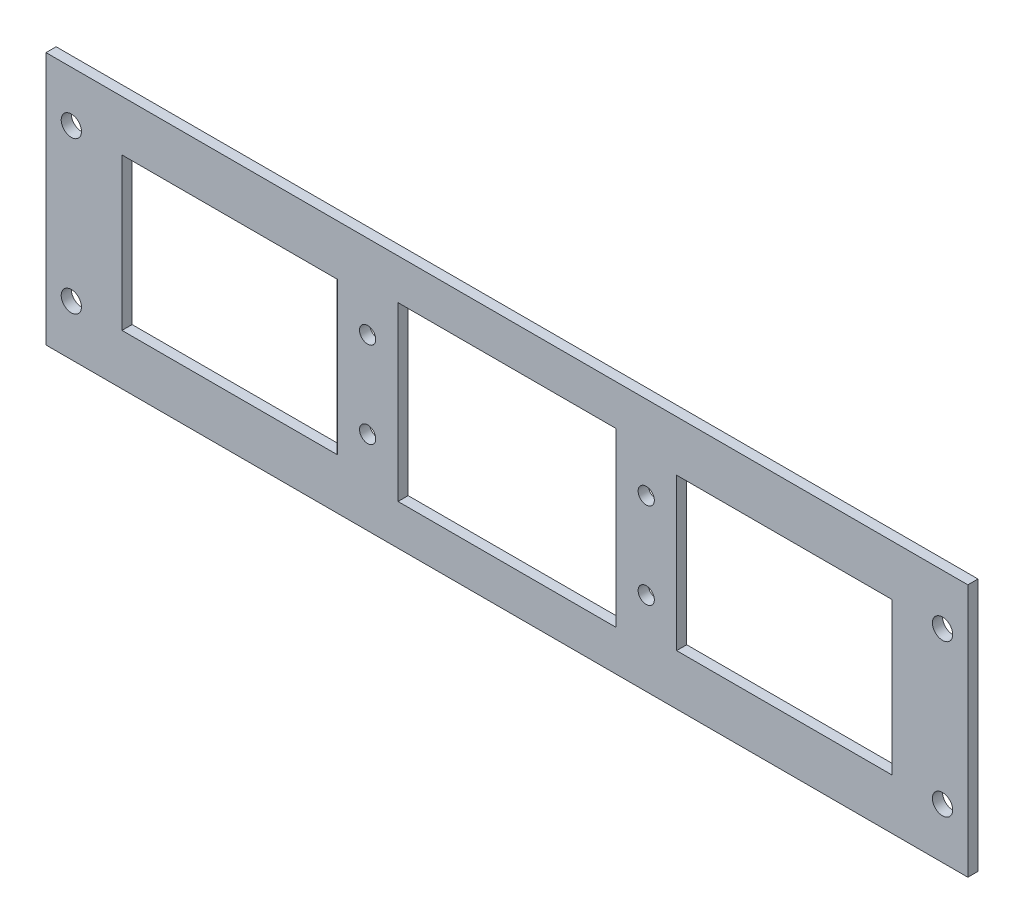
ISO-10303-21;
HEADER;
FILE_DESCRIPTION(('STEP AP214'),'2;1');
FILE_NAME('part.step','',(''),(''),'','','');
FILE_SCHEMA(('AUTOMOTIVE_DESIGN { 1 0 10303 214 1 1 1 1 }'));
ENDSEC;
DATA;
#1=APPLICATION_CONTEXT('core data for automotive mechanical design processes');
#2=APPLICATION_PROTOCOL_DEFINITION('international standard','automotive_design',2000,#1);
#3=PRODUCT_CONTEXT('',#1,'mechanical');
#4=PRODUCT('Part','Part','',(#3));
#5=PRODUCT_RELATED_PRODUCT_CATEGORY('part','',(#4));
#6=PRODUCT_DEFINITION_FORMATION('','',#4);
#7=PRODUCT_DEFINITION_CONTEXT('part definition',#1,'design');
#8=PRODUCT_DEFINITION('design','',#6,#7);
#9=PRODUCT_DEFINITION_SHAPE('','',#8);
#10=(LENGTH_UNIT() NAMED_UNIT(*) SI_UNIT(.MILLI.,.METRE.));
#11=(NAMED_UNIT(*) PLANE_ANGLE_UNIT() SI_UNIT($,.RADIAN.));
#12=(NAMED_UNIT(*) SI_UNIT($,.STERADIAN.) SOLID_ANGLE_UNIT());
#13=UNCERTAINTY_MEASURE_WITH_UNIT(LENGTH_MEASURE(1.E-05),#10,'distance_accuracy_value','');
#14=(GEOMETRIC_REPRESENTATION_CONTEXT(3) GLOBAL_UNCERTAINTY_ASSIGNED_CONTEXT((#13)) GLOBAL_UNIT_ASSIGNED_CONTEXT((#10,
#11,#12)) REPRESENTATION_CONTEXT('',''));
#15=CARTESIAN_POINT('',(0.,0.,0.));
#16=DIRECTION('',(0.,0.,1.));
#17=DIRECTION('',(1.,0.,0.));
#18=AXIS2_PLACEMENT_3D('',#15,#16,#17);
#19=CARTESIAN_POINT('',(0.,0.,2.));
#20=DIRECTION('',(0.,0.,-1.));
#21=DIRECTION('',(-1.,0.,0.));
#22=AXIS2_PLACEMENT_3D('',#19,#20,#21);
#23=PLANE('',#22);
#24=DIRECTION('',(-1.,0.,0.));
#25=VECTOR('',#24,1.);
#26=CARTESIAN_POINT('',(33.5,15.,2.));
#27=LINE('',#26,#25);
#28=CARTESIAN_POINT('',(76.,15.,2.));
#29=VERTEX_POINT('',#28);
#30=CARTESIAN_POINT('',(33.5,15.,2.));
#31=VERTEX_POINT('',#30);
#32=EDGE_CURVE('E203',#29,#31,#27,.T.);
#33=ORIENTED_EDGE('',*,*,#32,.F.);
#34=DIRECTION('',(0.,1.,0.));
#35=VECTOR('',#34,1.);
#36=CARTESIAN_POINT('',(76.,15.,2.));
#37=LINE('',#36,#35);
#38=CARTESIAN_POINT('',(76.,-15.,2.));
#39=VERTEX_POINT('',#38);
#40=EDGE_CURVE('E49',#39,#29,#37,.T.);
#41=ORIENTED_EDGE('',*,*,#40,.F.);
#42=DIRECTION('',(1.,0.,0.));
#43=VECTOR('',#42,1.);
#44=CARTESIAN_POINT('',(33.5,-15.,2.));
#45=LINE('',#44,#43);
#46=CARTESIAN_POINT('',(33.5,-15.,2.));
#47=VERTEX_POINT('',#46);
#48=EDGE_CURVE('E192',#47,#39,#45,.T.);
#49=ORIENTED_EDGE('',*,*,#48,.F.);
#50=DIRECTION('',(0.,-1.,0.));
#51=VECTOR('',#50,1.);
#52=CARTESIAN_POINT('',(33.5,15.,2.));
#53=LINE('',#52,#51);
#54=EDGE_CURVE('E206',#31,#47,#53,.T.);
#55=ORIENTED_EDGE('',*,*,#54,.F.);
#56=EDGE_LOOP('',(#33,#41,#49,#55));
#57=FACE_BOUND('',#56,.T.);
#58=DIRECTION('',(-1.,0.,0.));
#59=VECTOR('',#58,1.);
#60=CARTESIAN_POINT('',(-76.,15.,2.));
#61=LINE('',#60,#59);
#62=CARTESIAN_POINT('',(-33.5,15.,2.));
#63=VERTEX_POINT('',#62);
#64=CARTESIAN_POINT('',(-76.,15.,2.));
#65=VERTEX_POINT('',#64);
#66=EDGE_CURVE('E177',#63,#65,#61,.T.);
#67=ORIENTED_EDGE('',*,*,#66,.F.);
#68=DIRECTION('',(0.,1.,0.));
#69=VECTOR('',#68,1.);
#70=CARTESIAN_POINT('',(-33.5,15.,2.));
#71=LINE('',#70,#69);
#72=CARTESIAN_POINT('',(-33.5,-15.,2.));
#73=VERTEX_POINT('',#72);
#74=EDGE_CURVE('E57',#73,#63,#71,.T.);
#75=ORIENTED_EDGE('',*,*,#74,.F.);
#76=DIRECTION('',(1.,0.,0.));
#77=VECTOR('',#76,1.);
#78=CARTESIAN_POINT('',(-76.,-15.,2.));
#79=LINE('',#78,#77);
#80=CARTESIAN_POINT('',(-76.,-15.,2.));
#81=VERTEX_POINT('',#80);
#82=EDGE_CURVE('E168',#81,#73,#79,.T.);
#83=ORIENTED_EDGE('',*,*,#82,.F.);
#84=DIRECTION('',(0.,-1.,0.));
#85=VECTOR('',#84,1.);
#86=CARTESIAN_POINT('',(-76.,15.,2.));
#87=LINE('',#86,#85);
#88=EDGE_CURVE('E171',#65,#81,#87,.T.);
#89=ORIENTED_EDGE('',*,*,#88,.F.);
#90=EDGE_LOOP('',(#67,#75,#83,#89));
#91=FACE_BOUND('',#90,.T.);
#92=DIRECTION('',(-1.,0.,0.));
#93=VECTOR('',#92,1.);
#94=CARTESIAN_POINT('',(-21.5,17.,2.));
#95=LINE('',#94,#93);
#96=CARTESIAN_POINT('',(21.5,17.,2.));
#97=VERTEX_POINT('',#96);
#98=CARTESIAN_POINT('',(-21.5,17.,2.));
#99=VERTEX_POINT('',#98);
#100=EDGE_CURVE('E232',#97,#99,#95,.T.);
#101=ORIENTED_EDGE('',*,*,#100,.F.);
#102=DIRECTION('',(0.,1.,0.));
#103=VECTOR('',#102,1.);
#104=CARTESIAN_POINT('',(21.5,17.,2.));
#105=LINE('',#104,#103);
#106=CARTESIAN_POINT('',(21.5,-17.,2.));
#107=VERTEX_POINT('',#106);
#108=EDGE_CURVE('E184',#107,#97,#105,.T.);
#109=ORIENTED_EDGE('',*,*,#108,.F.);
#110=DIRECTION('',(1.,0.,0.));
#111=VECTOR('',#110,1.);
#112=CARTESIAN_POINT('',(-21.5,-17.,2.));
#113=LINE('',#112,#111);
#114=CARTESIAN_POINT('',(-21.5,-17.,2.));
#115=VERTEX_POINT('',#114);
#116=EDGE_CURVE('E221',#115,#107,#113,.T.);
#117=ORIENTED_EDGE('',*,*,#116,.F.);
#118=DIRECTION('',(0.,-1.,0.));
#119=VECTOR('',#118,1.);
#120=CARTESIAN_POINT('',(-21.5,17.,2.));
#121=LINE('',#120,#119);
#122=EDGE_CURVE('E235',#99,#115,#121,.T.);
#123=ORIENTED_EDGE('',*,*,#122,.F.);
#124=EDGE_LOOP('',(#101,#109,#117,#123));
#125=FACE_BOUND('',#124,.T.);
#126=CARTESIAN_POINT('',(-27.5,-8.5,2.));
#127=DIRECTION('',(0.,0.,1.));
#128=DIRECTION('',(1.,0.,0.));
#129=AXIS2_PLACEMENT_3D('',#126,#127,#128);
#130=CIRCLE('',#129,1.6);
#131=CARTESIAN_POINT('',(-25.9,-8.5,2.));
#132=VERTEX_POINT('',#131);
#133=EDGE_CURVE('E259',#132,#132,#130,.T.);
#134=ORIENTED_EDGE('',*,*,#133,.F.);
#135=EDGE_LOOP('',(#134));
#136=FACE_BOUND('',#135,.T.);
#137=CARTESIAN_POINT('',(27.5,8.5,2.));
#138=DIRECTION('',(0.,0.,1.));
#139=DIRECTION('',(1.,0.,0.));
#140=AXIS2_PLACEMENT_3D('',#137,#138,#139);
#141=CIRCLE('',#140,1.6);
#142=CARTESIAN_POINT('',(29.1,8.5,2.));
#143=VERTEX_POINT('',#142);
#144=EDGE_CURVE('E252',#143,#143,#141,.T.);
#145=ORIENTED_EDGE('',*,*,#144,.F.);
#146=EDGE_LOOP('',(#145));
#147=FACE_BOUND('',#146,.T.);
#148=CARTESIAN_POINT('',(27.5,-8.5,2.));
#149=DIRECTION('',(0.,0.,1.));
#150=DIRECTION('',(1.,0.,0.));
#151=AXIS2_PLACEMENT_3D('',#148,#149,#150);
#152=CIRCLE('',#151,1.6);
#153=CARTESIAN_POINT('',(29.1,-8.5,2.));
#154=VERTEX_POINT('',#153);
#155=EDGE_CURVE('E242',#154,#154,#152,.T.);
#156=ORIENTED_EDGE('',*,*,#155,.F.);
#157=EDGE_LOOP('',(#156));
#158=FACE_BOUND('',#157,.T.);
#159=CARTESIAN_POINT('',(-27.5,8.5,2.));
#160=DIRECTION('',(0.,0.,1.));
#161=DIRECTION('',(1.,0.,0.));
#162=AXIS2_PLACEMENT_3D('',#159,#160,#161);
#163=CIRCLE('',#162,1.6);
#164=CARTESIAN_POINT('',(-25.9,8.5,2.));
#165=VERTEX_POINT('',#164);
#166=EDGE_CURVE('E258',#165,#165,#163,.T.);
#167=ORIENTED_EDGE('',*,*,#166,.F.);
#168=EDGE_LOOP('',(#167));
#169=FACE_BOUND('',#168,.T.);
#170=DIRECTION('',(0.,1.,0.));
#171=VECTOR('',#170,1.);
#172=CARTESIAN_POINT('',(91.,-25.,2.));
#173=LINE('',#172,#171);
#174=CARTESIAN_POINT('',(91.,-25.,2.));
#175=VERTEX_POINT('',#174);
#176=CARTESIAN_POINT('',(91.,25.,2.));
#177=VERTEX_POINT('',#176);
#178=EDGE_CURVE('E297',#175,#177,#173,.T.);
#179=ORIENTED_EDGE('',*,*,#178,.T.);
#180=DIRECTION('',(-1.,0.,0.));
#181=VECTOR('',#180,1.);
#182=CARTESIAN_POINT('',(-91.,25.,2.));
#183=LINE('',#182,#181);
#184=CARTESIAN_POINT('',(-91.,25.,2.));
#185=VERTEX_POINT('',#184);
#186=EDGE_CURVE('E300',#177,#185,#183,.T.);
#187=ORIENTED_EDGE('',*,*,#186,.T.);
#188=DIRECTION('',(0.,-1.,0.));
#189=VECTOR('',#188,1.);
#190=CARTESIAN_POINT('',(-91.,-25.,2.));
#191=LINE('',#190,#189);
#192=CARTESIAN_POINT('',(-91.,-25.,2.));
#193=VERTEX_POINT('',#192);
#194=EDGE_CURVE('E303',#185,#193,#191,.T.);
#195=ORIENTED_EDGE('',*,*,#194,.T.);
#196=DIRECTION('',(1.,0.,0.));
#197=VECTOR('',#196,1.);
#198=CARTESIAN_POINT('',(-91.,-25.,2.));
#199=LINE('',#198,#197);
#200=EDGE_CURVE('E305',#193,#175,#199,.T.);
#201=ORIENTED_EDGE('',*,*,#200,.T.);
#202=EDGE_LOOP('',(#179,#187,#195,#201));
#203=FACE_BOUND('',#202,.T.);
#204=CARTESIAN_POINT('',(-86.,15.,2.));
#205=DIRECTION('',(0.,0.,1.));
#206=DIRECTION('',(1.,0.,0.));
#207=AXIS2_PLACEMENT_3D('',#204,#205,#206);
#208=CIRCLE('',#207,2.);
#209=CARTESIAN_POINT('',(-84.,15.,2.));
#210=VERTEX_POINT('',#209);
#211=EDGE_CURVE('E291',#210,#210,#208,.T.);
#212=ORIENTED_EDGE('',*,*,#211,.F.);
#213=EDGE_LOOP('',(#212));
#214=FACE_BOUND('',#213,.T.);
#215=CARTESIAN_POINT('',(86.,15.,2.));
#216=DIRECTION('',(0.,0.,1.));
#217=DIRECTION('',(1.,0.,0.));
#218=AXIS2_PLACEMENT_3D('',#215,#216,#217);
#219=CIRCLE('',#218,2.);
#220=CARTESIAN_POINT('',(88.,15.,2.));
#221=VERTEX_POINT('',#220);
#222=EDGE_CURVE('E285',#221,#221,#219,.T.);
#223=ORIENTED_EDGE('',*,*,#222,.F.);
#224=EDGE_LOOP('',(#223));
#225=FACE_BOUND('',#224,.T.);
#226=CARTESIAN_POINT('',(-86.,-15.,2.));
#227=DIRECTION('',(0.,0.,1.));
#228=DIRECTION('',(1.,0.,0.));
#229=AXIS2_PLACEMENT_3D('',#226,#227,#228);
#230=CIRCLE('',#229,2.);
#231=CARTESIAN_POINT('',(-84.,-15.,2.));
#232=VERTEX_POINT('',#231);
#233=EDGE_CURVE('E279',#232,#232,#230,.T.);
#234=ORIENTED_EDGE('',*,*,#233,.F.);
#235=EDGE_LOOP('',(#234));
#236=FACE_BOUND('',#235,.T.);
#237=CARTESIAN_POINT('',(86.,-15.,2.));
#238=DIRECTION('',(0.,0.,1.));
#239=DIRECTION('',(1.,0.,0.));
#240=AXIS2_PLACEMENT_3D('',#237,#238,#239);
#241=CIRCLE('',#240,2.);
#242=CARTESIAN_POINT('',(88.,-15.,2.));
#243=VERTEX_POINT('',#242);
#244=EDGE_CURVE('E273',#243,#243,#241,.T.);
#245=ORIENTED_EDGE('',*,*,#244,.F.);
#246=EDGE_LOOP('',(#245));
#247=FACE_BOUND('',#246,.T.);
#248=ADVANCED_FACE('F34',(#57,#91,#125,#136,#147,#158,#169,#203,#214,#225,#236,#247),#23,.F.);
#249=CARTESIAN_POINT('',(0.,0.,0.));
#250=DIRECTION('',(0.,0.,-1.));
#251=DIRECTION('',(-1.,0.,0.));
#252=AXIS2_PLACEMENT_3D('',#249,#250,#251);
#253=PLANE('',#252);
#254=DIRECTION('',(0.,1.,0.));
#255=VECTOR('',#254,1.);
#256=CARTESIAN_POINT('',(76.,15.,0.));
#257=LINE('',#256,#255);
#258=CARTESIAN_POINT('',(76.,-15.,0.));
#259=VERTEX_POINT('',#258);
#260=CARTESIAN_POINT('',(76.,15.,0.));
#261=VERTEX_POINT('',#260);
#262=EDGE_CURVE('E188',#259,#261,#257,.T.);
#263=ORIENTED_EDGE('',*,*,#262,.T.);
#264=DIRECTION('',(-1.,0.,0.));
#265=VECTOR('',#264,1.);
#266=CARTESIAN_POINT('',(33.5,15.,0.));
#267=LINE('',#266,#265);
#268=CARTESIAN_POINT('',(33.5,15.,0.));
#269=VERTEX_POINT('',#268);
#270=EDGE_CURVE('E191',#261,#269,#267,.T.);
#271=ORIENTED_EDGE('',*,*,#270,.T.);
#272=DIRECTION('',(0.,-1.,0.));
#273=VECTOR('',#272,1.);
#274=CARTESIAN_POINT('',(33.5,15.,0.));
#275=LINE('',#274,#273);
#276=CARTESIAN_POINT('',(33.5,-15.,0.));
#277=VERTEX_POINT('',#276);
#278=EDGE_CURVE('E195',#269,#277,#275,.T.);
#279=ORIENTED_EDGE('',*,*,#278,.T.);
#280=DIRECTION('',(1.,0.,0.));
#281=VECTOR('',#280,1.);
#282=CARTESIAN_POINT('',(33.5,-15.,0.));
#283=LINE('',#282,#281);
#284=EDGE_CURVE('E198',#277,#259,#283,.T.);
#285=ORIENTED_EDGE('',*,*,#284,.T.);
#286=EDGE_LOOP('',(#263,#271,#279,#285));
#287=FACE_BOUND('',#286,.T.);
#288=DIRECTION('',(0.,1.,0.));
#289=VECTOR('',#288,1.);
#290=CARTESIAN_POINT('',(-33.5,15.,0.));
#291=LINE('',#290,#289);
#292=CARTESIAN_POINT('',(-33.5,-15.,0.));
#293=VERTEX_POINT('',#292);
#294=CARTESIAN_POINT('',(-33.5,15.,0.));
#295=VERTEX_POINT('',#294);
#296=EDGE_CURVE('E149',#293,#295,#291,.T.);
#297=ORIENTED_EDGE('',*,*,#296,.T.);
#298=DIRECTION('',(-1.,0.,0.));
#299=VECTOR('',#298,1.);
#300=CARTESIAN_POINT('',(-76.,15.,0.));
#301=LINE('',#300,#299);
#302=CARTESIAN_POINT('',(-76.,15.,0.));
#303=VERTEX_POINT('',#302);
#304=EDGE_CURVE('E159',#295,#303,#301,.T.);
#305=ORIENTED_EDGE('',*,*,#304,.T.);
#306=DIRECTION('',(0.,-1.,0.));
#307=VECTOR('',#306,1.);
#308=CARTESIAN_POINT('',(-76.,15.,0.));
#309=LINE('',#308,#307);
#310=CARTESIAN_POINT('',(-76.,-15.,0.));
#311=VERTEX_POINT('',#310);
#312=EDGE_CURVE('E163',#303,#311,#309,.T.);
#313=ORIENTED_EDGE('',*,*,#312,.T.);
#314=DIRECTION('',(1.,0.,0.));
#315=VECTOR('',#314,1.);
#316=CARTESIAN_POINT('',(-76.,-15.,0.));
#317=LINE('',#316,#315);
#318=EDGE_CURVE('E155',#311,#293,#317,.T.);
#319=ORIENTED_EDGE('',*,*,#318,.T.);
#320=EDGE_LOOP('',(#297,#305,#313,#319));
#321=FACE_BOUND('',#320,.T.);
#322=DIRECTION('',(0.,1.,0.));
#323=VECTOR('',#322,1.);
#324=CARTESIAN_POINT('',(21.5,17.,0.));
#325=LINE('',#324,#323);
#326=CARTESIAN_POINT('',(21.5,-17.,0.));
#327=VERTEX_POINT('',#326);
#328=CARTESIAN_POINT('',(21.5,17.,0.));
#329=VERTEX_POINT('',#328);
#330=EDGE_CURVE('E217',#327,#329,#325,.T.);
#331=ORIENTED_EDGE('',*,*,#330,.T.);
#332=DIRECTION('',(-1.,0.,0.));
#333=VECTOR('',#332,1.);
#334=CARTESIAN_POINT('',(-21.5,17.,0.));
#335=LINE('',#334,#333);
#336=CARTESIAN_POINT('',(-21.5,17.,0.));
#337=VERTEX_POINT('',#336);
#338=EDGE_CURVE('E220',#329,#337,#335,.T.);
#339=ORIENTED_EDGE('',*,*,#338,.T.);
#340=DIRECTION('',(0.,-1.,0.));
#341=VECTOR('',#340,1.);
#342=CARTESIAN_POINT('',(-21.5,17.,0.));
#343=LINE('',#342,#341);
#344=CARTESIAN_POINT('',(-21.5,-17.,0.));
#345=VERTEX_POINT('',#344);
#346=EDGE_CURVE('E224',#337,#345,#343,.T.);
#347=ORIENTED_EDGE('',*,*,#346,.T.);
#348=DIRECTION('',(1.,0.,0.));
#349=VECTOR('',#348,1.);
#350=CARTESIAN_POINT('',(-21.5,-17.,0.));
#351=LINE('',#350,#349);
#352=EDGE_CURVE('E227',#345,#327,#351,.T.);
#353=ORIENTED_EDGE('',*,*,#352,.T.);
#354=EDGE_LOOP('',(#331,#339,#347,#353));
#355=FACE_BOUND('',#354,.T.);
#356=CARTESIAN_POINT('',(-27.5,-8.5,0.));
#357=DIRECTION('',(0.,0.,1.));
#358=DIRECTION('',(1.,0.,0.));
#359=AXIS2_PLACEMENT_3D('',#356,#357,#358);
#360=CIRCLE('',#359,1.6);
#361=CARTESIAN_POINT('',(-25.9,-8.5,0.));
#362=VERTEX_POINT('',#361);
#363=EDGE_CURVE('E255',#362,#362,#360,.T.);
#364=ORIENTED_EDGE('',*,*,#363,.T.);
#365=EDGE_LOOP('',(#364));
#366=FACE_BOUND('',#365,.T.);
#367=CARTESIAN_POINT('',(27.5,8.5,0.));
#368=DIRECTION('',(0.,0.,1.));
#369=DIRECTION('',(1.,0.,0.));
#370=AXIS2_PLACEMENT_3D('',#367,#368,#369);
#371=CIRCLE('',#370,1.6);
#372=CARTESIAN_POINT('',(29.1,8.5,0.));
#373=VERTEX_POINT('',#372);
#374=EDGE_CURVE('E262',#373,#373,#371,.T.);
#375=ORIENTED_EDGE('',*,*,#374,.T.);
#376=EDGE_LOOP('',(#375));
#377=FACE_BOUND('',#376,.T.);
#378=CARTESIAN_POINT('',(27.5,-8.5,0.));
#379=DIRECTION('',(0.,0.,1.));
#380=DIRECTION('',(1.,0.,0.));
#381=AXIS2_PLACEMENT_3D('',#378,#379,#380);
#382=CIRCLE('',#381,1.6);
#383=CARTESIAN_POINT('',(29.1,-8.5,0.));
#384=VERTEX_POINT('',#383);
#385=EDGE_CURVE('E249',#384,#384,#382,.T.);
#386=ORIENTED_EDGE('',*,*,#385,.T.);
#387=EDGE_LOOP('',(#386));
#388=FACE_BOUND('',#387,.T.);
#389=CARTESIAN_POINT('',(-27.5,8.5,0.));
#390=DIRECTION('',(0.,0.,1.));
#391=DIRECTION('',(1.,0.,0.));
#392=AXIS2_PLACEMENT_3D('',#389,#390,#391);
#393=CIRCLE('',#392,1.6);
#394=CARTESIAN_POINT('',(-25.9,8.5,0.));
#395=VERTEX_POINT('',#394);
#396=EDGE_CURVE('E267',#395,#395,#393,.T.);
#397=ORIENTED_EDGE('',*,*,#396,.T.);
#398=EDGE_LOOP('',(#397));
#399=FACE_BOUND('',#398,.T.);
#400=CARTESIAN_POINT('',(-86.,-15.,0.));
#401=DIRECTION('',(0.,0.,1.));
#402=DIRECTION('',(1.,0.,0.));
#403=AXIS2_PLACEMENT_3D('',#400,#401,#402);
#404=CIRCLE('',#403,2.);
#405=CARTESIAN_POINT('',(-84.,-15.,0.));
#406=VERTEX_POINT('',#405);
#407=EDGE_CURVE('E276',#406,#406,#404,.T.);
#408=ORIENTED_EDGE('',*,*,#407,.T.);
#409=EDGE_LOOP('',(#408));
#410=FACE_BOUND('',#409,.T.);
#411=CARTESIAN_POINT('',(-86.,15.,0.));
#412=DIRECTION('',(0.,0.,1.));
#413=DIRECTION('',(1.,0.,0.));
#414=AXIS2_PLACEMENT_3D('',#411,#412,#413);
#415=CIRCLE('',#414,2.);
#416=CARTESIAN_POINT('',(-84.,15.,0.));
#417=VERTEX_POINT('',#416);
#418=EDGE_CURVE('E288',#417,#417,#415,.T.);
#419=ORIENTED_EDGE('',*,*,#418,.T.);
#420=EDGE_LOOP('',(#419));
#421=FACE_BOUND('',#420,.T.);
#422=DIRECTION('',(0.,1.,0.));
#423=VECTOR('',#422,1.);
#424=CARTESIAN_POINT('',(91.,-25.,0.));
#425=LINE('',#424,#423);
#426=CARTESIAN_POINT('',(91.,-25.,0.));
#427=VERTEX_POINT('',#426);
#428=CARTESIAN_POINT('',(91.,25.,0.));
#429=VERTEX_POINT('',#428);
#430=EDGE_CURVE('E294',#427,#429,#425,.T.);
#431=ORIENTED_EDGE('',*,*,#430,.F.);
#432=DIRECTION('',(1.,0.,0.));
#433=VECTOR('',#432,1.);
#434=CARTESIAN_POINT('',(-91.,-25.,0.));
#435=LINE('',#434,#433);
#436=CARTESIAN_POINT('',(-91.,-25.,0.));
#437=VERTEX_POINT('',#436);
#438=EDGE_CURVE('E301',#437,#427,#435,.T.);
#439=ORIENTED_EDGE('',*,*,#438,.F.);
#440=DIRECTION('',(0.,-1.,0.));
#441=VECTOR('',#440,1.);
#442=CARTESIAN_POINT('',(-91.,-25.,0.));
#443=LINE('',#442,#441);
#444=CARTESIAN_POINT('',(-91.,25.,0.));
#445=VERTEX_POINT('',#444);
#446=EDGE_CURVE('E312',#445,#437,#443,.T.);
#447=ORIENTED_EDGE('',*,*,#446,.F.);
#448=DIRECTION('',(-1.,0.,0.));
#449=VECTOR('',#448,1.);
#450=CARTESIAN_POINT('',(-91.,25.,0.));
#451=LINE('',#450,#449);
#452=EDGE_CURVE('E310',#429,#445,#451,.T.);
#453=ORIENTED_EDGE('',*,*,#452,.F.);
#454=EDGE_LOOP('',(#431,#439,#447,#453));
#455=FACE_BOUND('',#454,.T.);
#456=CARTESIAN_POINT('',(86.,15.,0.));
#457=DIRECTION('',(0.,0.,1.));
#458=DIRECTION('',(1.,0.,0.));
#459=AXIS2_PLACEMENT_3D('',#456,#457,#458);
#460=CIRCLE('',#459,2.);
#461=CARTESIAN_POINT('',(88.,15.,0.));
#462=VERTEX_POINT('',#461);
#463=EDGE_CURVE('E282',#462,#462,#460,.T.);
#464=ORIENTED_EDGE('',*,*,#463,.T.);
#465=EDGE_LOOP('',(#464));
#466=FACE_BOUND('',#465,.T.);
#467=CARTESIAN_POINT('',(86.,-15.,0.));
#468=DIRECTION('',(0.,0.,1.));
#469=DIRECTION('',(1.,0.,0.));
#470=AXIS2_PLACEMENT_3D('',#467,#468,#469);
#471=CIRCLE('',#470,2.);
#472=CARTESIAN_POINT('',(88.,-15.,0.));
#473=VERTEX_POINT('',#472);
#474=EDGE_CURVE('E270',#473,#473,#471,.T.);
#475=ORIENTED_EDGE('',*,*,#474,.T.);
#476=EDGE_LOOP('',(#475));
#477=FACE_BOUND('',#476,.T.);
#478=ADVANCED_FACE('F165',(#287,#321,#355,#366,#377,#388,#399,#410,#421,#455,#466,#477),#253,.T.);
#479=CARTESIAN_POINT('',(91.,-25.,2.));
#480=DIRECTION('',(-1.,0.,0.));
#481=DIRECTION('',(0.,0.,1.));
#482=AXIS2_PLACEMENT_3D('',#479,#480,#481);
#483=PLANE('',#482);
#484=ORIENTED_EDGE('',*,*,#430,.T.);
#485=DIRECTION('',(0.,0.,-1.));
#486=VECTOR('',#485,1.);
#487=CARTESIAN_POINT('',(91.,25.,2.));
#488=LINE('',#487,#486);
#489=EDGE_CURVE('E11',#177,#429,#488,.T.);
#490=ORIENTED_EDGE('',*,*,#489,.F.);
#491=ORIENTED_EDGE('',*,*,#178,.F.);
#492=DIRECTION('',(0.,0.,-1.));
#493=VECTOR('',#492,1.);
#494=CARTESIAN_POINT('',(91.,-25.,2.));
#495=LINE('',#494,#493);
#496=EDGE_CURVE('E307',#175,#427,#495,.T.);
#497=ORIENTED_EDGE('',*,*,#496,.T.);
#498=EDGE_LOOP('',(#484,#490,#491,#497));
#499=FACE_BOUND('',#498,.T.);
#500=ADVANCED_FACE('F36',(#499),#483,.F.);
#501=CARTESIAN_POINT('',(-91.,25.,2.));
#502=DIRECTION('',(0.,-1.,0.));
#503=DIRECTION('',(0.,0.,-1.));
#504=AXIS2_PLACEMENT_3D('',#501,#502,#503);
#505=PLANE('',#504);
#506=ORIENTED_EDGE('',*,*,#452,.T.);
#507=DIRECTION('',(0.,0.,-1.));
#508=VECTOR('',#507,1.);
#509=CARTESIAN_POINT('',(-91.,25.,2.));
#510=LINE('',#509,#508);
#511=EDGE_CURVE('E42',#185,#445,#510,.T.);
#512=ORIENTED_EDGE('',*,*,#511,.F.);
#513=ORIENTED_EDGE('',*,*,#186,.F.);
#514=ORIENTED_EDGE('',*,*,#489,.T.);
#515=EDGE_LOOP('',(#506,#512,#513,#514));
#516=FACE_BOUND('',#515,.T.);
#517=ADVANCED_FACE('F340',(#516),#505,.F.);
#518=CARTESIAN_POINT('',(-91.,-25.,2.));
#519=DIRECTION('',(1.,0.,0.));
#520=DIRECTION('',(0.,0.,-1.));
#521=AXIS2_PLACEMENT_3D('',#518,#519,#520);
#522=PLANE('',#521);
#523=ORIENTED_EDGE('',*,*,#446,.T.);
#524=DIRECTION('',(0.,0.,-1.));
#525=VECTOR('',#524,1.);
#526=CARTESIAN_POINT('',(-91.,-25.,2.));
#527=LINE('',#526,#525);
#528=EDGE_CURVE('E317',#193,#437,#527,.T.);
#529=ORIENTED_EDGE('',*,*,#528,.F.);
#530=ORIENTED_EDGE('',*,*,#194,.F.);
#531=ORIENTED_EDGE('',*,*,#511,.T.);
#532=EDGE_LOOP('',(#523,#529,#530,#531));
#533=FACE_BOUND('',#532,.T.);
#534=ADVANCED_FACE('F324',(#533),#522,.F.);
#535=CARTESIAN_POINT('',(-91.,-25.,2.));
#536=DIRECTION('',(0.,1.,0.));
#537=DIRECTION('',(0.,0.,1.));
#538=AXIS2_PLACEMENT_3D('',#535,#536,#537);
#539=PLANE('',#538);
#540=ORIENTED_EDGE('',*,*,#438,.T.);
#541=ORIENTED_EDGE('',*,*,#496,.F.);
#542=ORIENTED_EDGE('',*,*,#200,.F.);
#543=ORIENTED_EDGE('',*,*,#528,.T.);
#544=EDGE_LOOP('',(#540,#541,#542,#543));
#545=FACE_BOUND('',#544,.T.);
#546=ADVANCED_FACE('F333',(#545),#539,.F.);
#547=CARTESIAN_POINT('',(-86.,15.,2.));
#548=DIRECTION('',(0.,0.,-1.));
#549=DIRECTION('',(-1.,0.,0.));
#550=AXIS2_PLACEMENT_3D('',#547,#548,#549);
#551=CYLINDRICAL_SURFACE('',#550,2.);
#552=ORIENTED_EDGE('',*,*,#211,.T.);
#553=EDGE_LOOP('',(#552));
#554=FACE_BOUND('',#553,.T.);
#555=ORIENTED_EDGE('',*,*,#418,.F.);
#556=EDGE_LOOP('',(#555));
#557=FACE_BOUND('',#556,.T.);
#558=ADVANCED_FACE('F358',(#554,#557),#551,.F.);
#559=CARTESIAN_POINT('',(86.,15.,2.));
#560=DIRECTION('',(0.,0.,-1.));
#561=DIRECTION('',(-1.,0.,0.));
#562=AXIS2_PLACEMENT_3D('',#559,#560,#561);
#563=CYLINDRICAL_SURFACE('',#562,2.);
#564=ORIENTED_EDGE('',*,*,#222,.T.);
#565=EDGE_LOOP('',(#564));
#566=FACE_BOUND('',#565,.T.);
#567=ORIENTED_EDGE('',*,*,#463,.F.);
#568=EDGE_LOOP('',(#567));
#569=FACE_BOUND('',#568,.T.);
#570=ADVANCED_FACE('F365',(#566,#569),#563,.F.);
#571=CARTESIAN_POINT('',(-86.,-15.,2.));
#572=DIRECTION('',(0.,0.,-1.));
#573=DIRECTION('',(-1.,0.,0.));
#574=AXIS2_PLACEMENT_3D('',#571,#572,#573);
#575=CYLINDRICAL_SURFACE('',#574,2.);
#576=ORIENTED_EDGE('',*,*,#233,.T.);
#577=EDGE_LOOP('',(#576));
#578=FACE_BOUND('',#577,.T.);
#579=ORIENTED_EDGE('',*,*,#407,.F.);
#580=EDGE_LOOP('',(#579));
#581=FACE_BOUND('',#580,.T.);
#582=ADVANCED_FACE('F370',(#578,#581),#575,.F.);
#583=CARTESIAN_POINT('',(86.,-15.,2.));
#584=DIRECTION('',(0.,0.,-1.));
#585=DIRECTION('',(-1.,0.,0.));
#586=AXIS2_PLACEMENT_3D('',#583,#584,#585);
#587=CYLINDRICAL_SURFACE('',#586,2.);
#588=ORIENTED_EDGE('',*,*,#244,.T.);
#589=EDGE_LOOP('',(#588));
#590=FACE_BOUND('',#589,.T.);
#591=ORIENTED_EDGE('',*,*,#474,.F.);
#592=EDGE_LOOP('',(#591));
#593=FACE_BOUND('',#592,.T.);
#594=ADVANCED_FACE('F383',(#590,#593),#587,.F.);
#595=CARTESIAN_POINT('',(-27.5,8.5,0.));
#596=DIRECTION('',(0.,0.,1.));
#597=DIRECTION('',(1.,0.,0.));
#598=AXIS2_PLACEMENT_3D('',#595,#596,#597);
#599=CYLINDRICAL_SURFACE('',#598,1.6);
#600=ORIENTED_EDGE('',*,*,#396,.F.);
#601=EDGE_LOOP('',(#600));
#602=FACE_BOUND('',#601,.T.);
#603=ORIENTED_EDGE('',*,*,#166,.T.);
#604=EDGE_LOOP('',(#603));
#605=FACE_BOUND('',#604,.T.);
#606=ADVANCED_FACE('F386',(#602,#605),#599,.F.);
#607=CARTESIAN_POINT('',(27.5,-8.5,0.));
#608=DIRECTION('',(0.,0.,1.));
#609=DIRECTION('',(1.,0.,0.));
#610=AXIS2_PLACEMENT_3D('',#607,#608,#609);
#611=CYLINDRICAL_SURFACE('',#610,1.6);
#612=ORIENTED_EDGE('',*,*,#385,.F.);
#613=EDGE_LOOP('',(#612));
#614=FACE_BOUND('',#613,.T.);
#615=ORIENTED_EDGE('',*,*,#155,.T.);
#616=EDGE_LOOP('',(#615));
#617=FACE_BOUND('',#616,.T.);
#618=ADVANCED_FACE('F394',(#614,#617),#611,.F.);
#619=CARTESIAN_POINT('',(27.5,8.5,0.));
#620=DIRECTION('',(0.,0.,1.));
#621=DIRECTION('',(1.,0.,0.));
#622=AXIS2_PLACEMENT_3D('',#619,#620,#621);
#623=CYLINDRICAL_SURFACE('',#622,1.6);
#624=ORIENTED_EDGE('',*,*,#374,.F.);
#625=EDGE_LOOP('',(#624));
#626=FACE_BOUND('',#625,.T.);
#627=ORIENTED_EDGE('',*,*,#144,.T.);
#628=EDGE_LOOP('',(#627));
#629=FACE_BOUND('',#628,.T.);
#630=ADVANCED_FACE('F400',(#626,#629),#623,.F.);
#631=CARTESIAN_POINT('',(-27.5,-8.5,0.));
#632=DIRECTION('',(0.,0.,1.));
#633=DIRECTION('',(1.,0.,0.));
#634=AXIS2_PLACEMENT_3D('',#631,#632,#633);
#635=CYLINDRICAL_SURFACE('',#634,1.6);
#636=ORIENTED_EDGE('',*,*,#363,.F.);
#637=EDGE_LOOP('',(#636));
#638=FACE_BOUND('',#637,.T.);
#639=ORIENTED_EDGE('',*,*,#133,.T.);
#640=EDGE_LOOP('',(#639));
#641=FACE_BOUND('',#640,.T.);
#642=ADVANCED_FACE('F403',(#638,#641),#635,.F.);
#643=CARTESIAN_POINT('',(21.5,17.,0.));
#644=DIRECTION('',(1.,0.,0.));
#645=DIRECTION('',(0.,0.,-1.));
#646=AXIS2_PLACEMENT_3D('',#643,#644,#645);
#647=PLANE('',#646);
#648=ORIENTED_EDGE('',*,*,#108,.T.);
#649=DIRECTION('',(0.,0.,1.));
#650=VECTOR('',#649,1.);
#651=CARTESIAN_POINT('',(21.5,17.,0.));
#652=LINE('',#651,#650);
#653=EDGE_CURVE('E230',#329,#97,#652,.T.);
#654=ORIENTED_EDGE('',*,*,#653,.F.);
#655=ORIENTED_EDGE('',*,*,#330,.F.);
#656=DIRECTION('',(0.,0.,1.));
#657=VECTOR('',#656,1.);
#658=CARTESIAN_POINT('',(21.5,-17.,0.));
#659=LINE('',#658,#657);
#660=EDGE_CURVE('E240',#327,#107,#659,.T.);
#661=ORIENTED_EDGE('',*,*,#660,.T.);
#662=EDGE_LOOP('',(#648,#654,#655,#661));
#663=FACE_BOUND('',#662,.T.);
#664=ADVANCED_FACE('F407',(#663),#647,.F.);
#665=CARTESIAN_POINT('',(-21.5,-17.,0.));
#666=DIRECTION('',(0.,-1.,0.));
#667=DIRECTION('',(0.,0.,-1.));
#668=AXIS2_PLACEMENT_3D('',#665,#666,#667);
#669=PLANE('',#668);
#670=ORIENTED_EDGE('',*,*,#116,.T.);
#671=ORIENTED_EDGE('',*,*,#660,.F.);
#672=ORIENTED_EDGE('',*,*,#352,.F.);
#673=DIRECTION('',(0.,0.,1.));
#674=VECTOR('',#673,1.);
#675=CARTESIAN_POINT('',(-21.5,-17.,0.));
#676=LINE('',#675,#674);
#677=EDGE_CURVE('E243',#345,#115,#676,.T.);
#678=ORIENTED_EDGE('',*,*,#677,.T.);
#679=EDGE_LOOP('',(#670,#671,#672,#678));
#680=FACE_BOUND('',#679,.T.);
#681=ADVANCED_FACE('F414',(#680),#669,.F.);
#682=CARTESIAN_POINT('',(-21.5,17.,0.));
#683=DIRECTION('',(-1.,0.,0.));
#684=DIRECTION('',(0.,0.,1.));
#685=AXIS2_PLACEMENT_3D('',#682,#683,#684);
#686=PLANE('',#685);
#687=ORIENTED_EDGE('',*,*,#122,.T.);
#688=ORIENTED_EDGE('',*,*,#677,.F.);
#689=ORIENTED_EDGE('',*,*,#346,.F.);
#690=DIRECTION('',(0.,0.,1.));
#691=VECTOR('',#690,1.);
#692=CARTESIAN_POINT('',(-21.5,17.,0.));
#693=LINE('',#692,#691);
#694=EDGE_CURVE('E245',#337,#99,#693,.T.);
#695=ORIENTED_EDGE('',*,*,#694,.T.);
#696=EDGE_LOOP('',(#687,#688,#689,#695));
#697=FACE_BOUND('',#696,.T.);
#698=ADVANCED_FACE('F419',(#697),#686,.F.);
#699=CARTESIAN_POINT('',(-21.5,17.,0.));
#700=DIRECTION('',(0.,1.,0.));
#701=DIRECTION('',(0.,0.,1.));
#702=AXIS2_PLACEMENT_3D('',#699,#700,#701);
#703=PLANE('',#702);
#704=ORIENTED_EDGE('',*,*,#100,.T.);
#705=ORIENTED_EDGE('',*,*,#694,.F.);
#706=ORIENTED_EDGE('',*,*,#338,.F.);
#707=ORIENTED_EDGE('',*,*,#653,.T.);
#708=EDGE_LOOP('',(#704,#705,#706,#707));
#709=FACE_BOUND('',#708,.T.);
#710=ADVANCED_FACE('F416',(#709),#703,.F.);
#711=CARTESIAN_POINT('',(-33.5,15.,0.));
#712=DIRECTION('',(1.,0.,0.));
#713=DIRECTION('',(0.,0.,-1.));
#714=AXIS2_PLACEMENT_3D('',#711,#712,#713);
#715=PLANE('',#714);
#716=ORIENTED_EDGE('',*,*,#74,.T.);
#717=DIRECTION('',(0.,0.,1.));
#718=VECTOR('',#717,1.);
#719=CARTESIAN_POINT('',(-33.5,15.,0.));
#720=LINE('',#719,#718);
#721=EDGE_CURVE('E145',#295,#63,#720,.T.);
#722=ORIENTED_EDGE('',*,*,#721,.F.);
#723=ORIENTED_EDGE('',*,*,#296,.F.);
#724=DIRECTION('',(0.,0.,1.));
#725=VECTOR('',#724,1.);
#726=CARTESIAN_POINT('',(-33.5,-15.,0.));
#727=LINE('',#726,#725);
#728=EDGE_CURVE('E182',#293,#73,#727,.T.);
#729=ORIENTED_EDGE('',*,*,#728,.T.);
#730=EDGE_LOOP('',(#716,#722,#723,#729));
#731=FACE_BOUND('',#730,.T.);
#732=ADVANCED_FACE('F147',(#731),#715,.F.);
#733=CARTESIAN_POINT('',(-76.,-15.,0.));
#734=DIRECTION('',(0.,-1.,0.));
#735=DIRECTION('',(1.,0.,0.));
#736=AXIS2_PLACEMENT_3D('',#733,#734,#735);
#737=PLANE('',#736);
#738=ORIENTED_EDGE('',*,*,#82,.T.);
#739=ORIENTED_EDGE('',*,*,#728,.F.);
#740=ORIENTED_EDGE('',*,*,#318,.F.);
#741=DIRECTION('',(0.,0.,1.));
#742=VECTOR('',#741,1.);
#743=CARTESIAN_POINT('',(-76.,-15.,0.));
#744=LINE('',#743,#742);
#745=EDGE_CURVE('E185',#311,#81,#744,.T.);
#746=ORIENTED_EDGE('',*,*,#745,.T.);
#747=EDGE_LOOP('',(#738,#739,#740,#746));
#748=FACE_BOUND('',#747,.T.);
#749=ADVANCED_FACE('F444',(#748),#737,.F.);
#750=CARTESIAN_POINT('',(-76.,15.,0.));
#751=DIRECTION('',(-1.,0.,0.));
#752=DIRECTION('',(0.,0.,1.));
#753=AXIS2_PLACEMENT_3D('',#750,#751,#752);
#754=PLANE('',#753);
#755=ORIENTED_EDGE('',*,*,#88,.T.);
#756=ORIENTED_EDGE('',*,*,#745,.F.);
#757=ORIENTED_EDGE('',*,*,#312,.F.);
#758=DIRECTION('',(0.,0.,1.));
#759=VECTOR('',#758,1.);
#760=CARTESIAN_POINT('',(-76.,15.,0.));
#761=LINE('',#760,#759);
#762=EDGE_CURVE('E154',#303,#65,#761,.T.);
#763=ORIENTED_EDGE('',*,*,#762,.T.);
#764=EDGE_LOOP('',(#755,#756,#757,#763));
#765=FACE_BOUND('',#764,.T.);
#766=ADVANCED_FACE('F447',(#765),#754,.F.);
#767=CARTESIAN_POINT('',(-76.,15.,0.));
#768=DIRECTION('',(0.,1.,0.));
#769=DIRECTION('',(-1.,0.,0.));
#770=AXIS2_PLACEMENT_3D('',#767,#768,#769);
#771=PLANE('',#770);
#772=ORIENTED_EDGE('',*,*,#66,.T.);
#773=ORIENTED_EDGE('',*,*,#762,.F.);
#774=ORIENTED_EDGE('',*,*,#304,.F.);
#775=ORIENTED_EDGE('',*,*,#721,.T.);
#776=EDGE_LOOP('',(#772,#773,#774,#775));
#777=FACE_BOUND('',#776,.T.);
#778=ADVANCED_FACE('F160',(#777),#771,.F.);
#779=CARTESIAN_POINT('',(76.,15.,0.));
#780=DIRECTION('',(1.,0.,0.));
#781=DIRECTION('',(0.,0.,-1.));
#782=AXIS2_PLACEMENT_3D('',#779,#780,#781);
#783=PLANE('',#782);
#784=ORIENTED_EDGE('',*,*,#40,.T.);
#785=DIRECTION('',(0.,0.,1.));
#786=VECTOR('',#785,1.);
#787=CARTESIAN_POINT('',(76.,15.,0.));
#788=LINE('',#787,#786);
#789=EDGE_CURVE('E201',#261,#29,#788,.T.);
#790=ORIENTED_EDGE('',*,*,#789,.F.);
#791=ORIENTED_EDGE('',*,*,#262,.F.);
#792=DIRECTION('',(0.,0.,1.));
#793=VECTOR('',#792,1.);
#794=CARTESIAN_POINT('',(76.,-15.,0.));
#795=LINE('',#794,#793);
#796=EDGE_CURVE('E178',#259,#39,#795,.T.);
#797=ORIENTED_EDGE('',*,*,#796,.T.);
#798=EDGE_LOOP('',(#784,#790,#791,#797));
#799=FACE_BOUND('',#798,.T.);
#800=ADVANCED_FACE('F427',(#799),#783,.F.);
#801=CARTESIAN_POINT('',(33.5,-15.,0.));
#802=DIRECTION('',(0.,-1.,0.));
#803=DIRECTION('',(1.,0.,0.));
#804=AXIS2_PLACEMENT_3D('',#801,#802,#803);
#805=PLANE('',#804);
#806=ORIENTED_EDGE('',*,*,#48,.T.);
#807=ORIENTED_EDGE('',*,*,#796,.F.);
#808=ORIENTED_EDGE('',*,*,#284,.F.);
#809=DIRECTION('',(0.,0.,1.));
#810=VECTOR('',#809,1.);
#811=CARTESIAN_POINT('',(33.5,-15.,0.));
#812=LINE('',#811,#810);
#813=EDGE_CURVE('E212',#277,#47,#812,.T.);
#814=ORIENTED_EDGE('',*,*,#813,.T.);
#815=EDGE_LOOP('',(#806,#807,#808,#814));
#816=FACE_BOUND('',#815,.T.);
#817=ADVANCED_FACE('F430',(#816),#805,.F.);
#818=CARTESIAN_POINT('',(33.5,15.,0.));
#819=DIRECTION('',(-1.,0.,0.));
#820=DIRECTION('',(0.,0.,1.));
#821=AXIS2_PLACEMENT_3D('',#818,#819,#820);
#822=PLANE('',#821);
#823=ORIENTED_EDGE('',*,*,#54,.T.);
#824=ORIENTED_EDGE('',*,*,#813,.F.);
#825=ORIENTED_EDGE('',*,*,#278,.F.);
#826=DIRECTION('',(0.,0.,1.));
#827=VECTOR('',#826,1.);
#828=CARTESIAN_POINT('',(33.5,15.,0.));
#829=LINE('',#828,#827);
#830=EDGE_CURVE('E214',#269,#31,#829,.T.);
#831=ORIENTED_EDGE('',*,*,#830,.T.);
#832=EDGE_LOOP('',(#823,#824,#825,#831));
#833=FACE_BOUND('',#832,.T.);
#834=ADVANCED_FACE('F434',(#833),#822,.F.);
#835=CARTESIAN_POINT('',(33.5,15.,0.));
#836=DIRECTION('',(0.,1.,0.));
#837=DIRECTION('',(-1.,0.,0.));
#838=AXIS2_PLACEMENT_3D('',#835,#836,#837);
#839=PLANE('',#838);
#840=ORIENTED_EDGE('',*,*,#32,.T.);
#841=ORIENTED_EDGE('',*,*,#830,.F.);
#842=ORIENTED_EDGE('',*,*,#270,.F.);
#843=ORIENTED_EDGE('',*,*,#789,.T.);
#844=EDGE_LOOP('',(#840,#841,#842,#843));
#845=FACE_BOUND('',#844,.T.);
#846=ADVANCED_FACE('F431',(#845),#839,.F.);
#847=CLOSED_SHELL('',(#248,#478,#500,#517,#534,#546,#558,#570,#582,#594,#606,#618,#630,#642,
#664,#681,#698,#710,#732,#749,#766,#778,#800,#817,#834,#846));
#848=MANIFOLD_SOLID_BREP('B2',#847);
#849=ADVANCED_BREP_SHAPE_REPRESENTATION('',(#18,#848),#14);
#850=SHAPE_DEFINITION_REPRESENTATION(#9,#849);
ENDSEC;
END-ISO-10303-21;
